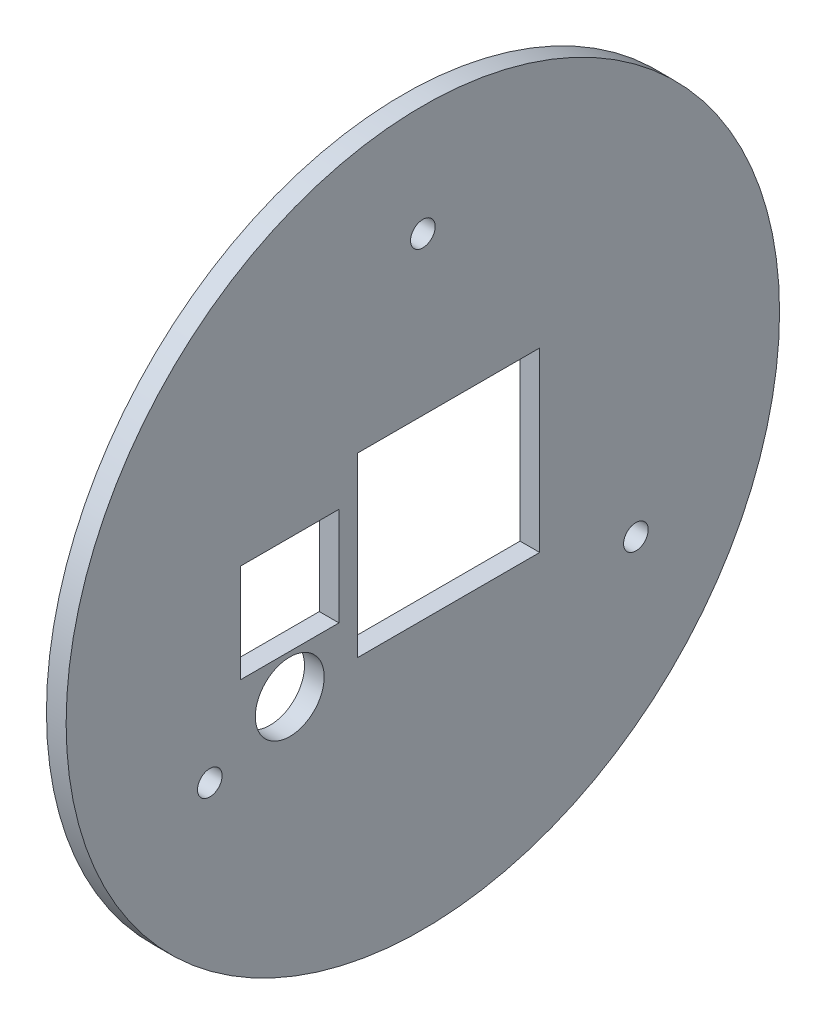
ISO-10303-21;
HEADER;
FILE_DESCRIPTION(('STEP AP214'),'2;1');
FILE_NAME('part.step','',(''),(''),'','','');
FILE_SCHEMA(('AUTOMOTIVE_DESIGN { 1 0 10303 214 1 1 1 1 }'));
ENDSEC;
DATA;
#1=APPLICATION_CONTEXT('core data for automotive mechanical design processes');
#2=APPLICATION_PROTOCOL_DEFINITION('international standard','automotive_design',2000,#1);
#3=PRODUCT_CONTEXT('',#1,'mechanical');
#4=PRODUCT('Part','Part','',(#3));
#5=PRODUCT_RELATED_PRODUCT_CATEGORY('part','',(#4));
#6=PRODUCT_DEFINITION_FORMATION('','',#4);
#7=PRODUCT_DEFINITION_CONTEXT('part definition',#1,'design');
#8=PRODUCT_DEFINITION('design','',#6,#7);
#9=PRODUCT_DEFINITION_SHAPE('','',#8);
#10=(LENGTH_UNIT() NAMED_UNIT(*) SI_UNIT(.MILLI.,.METRE.));
#11=(NAMED_UNIT(*) PLANE_ANGLE_UNIT() SI_UNIT($,.RADIAN.));
#12=(NAMED_UNIT(*) SI_UNIT($,.STERADIAN.) SOLID_ANGLE_UNIT());
#13=UNCERTAINTY_MEASURE_WITH_UNIT(LENGTH_MEASURE(1.E-05),#10,'distance_accuracy_value','');
#14=(GEOMETRIC_REPRESENTATION_CONTEXT(3) GLOBAL_UNCERTAINTY_ASSIGNED_CONTEXT((#13)) GLOBAL_UNIT_ASSIGNED_CONTEXT((#10,
#11,#12)) REPRESENTATION_CONTEXT('',''));
#15=CARTESIAN_POINT('',(0.,0.,0.));
#16=DIRECTION('',(0.,0.,1.));
#17=DIRECTION('',(1.,0.,0.));
#18=AXIS2_PLACEMENT_3D('',#15,#16,#17);
#19=CARTESIAN_POINT('',(4.,0.,0.));
#20=DIRECTION('',(1.,0.,0.));
#21=DIRECTION('',(0.,0.,-1.));
#22=AXIS2_PLACEMENT_3D('',#19,#20,#21);
#23=PLANE('',#22);
#24=CARTESIAN_POINT('',(4.,-25.0000000000019,43.3012701892187));
#25=DIRECTION('',(1.,0.,0.));
#26=DIRECTION('',(0.,0.,-1.));
#27=AXIS2_PLACEMENT_3D('',#24,#25,#26);
#28=CIRCLE('',#27,2.50000000000406);
#29=CARTESIAN_POINT('',(4.,-25.0000000000019,40.8012701892147));
#30=VERTEX_POINT('',#29);
#31=EDGE_CURVE('E140',#30,#30,#28,.T.);
#32=ORIENTED_EDGE('',*,*,#31,.F.);
#33=EDGE_LOOP('',(#32));
#34=FACE_BOUND('',#33,.T.);
#35=CARTESIAN_POINT('',(4.,50.,0.));
#36=DIRECTION('',(1.,0.,0.));
#37=DIRECTION('',(0.,0.,-1.));
#38=AXIS2_PLACEMENT_3D('',#35,#36,#37);
#39=CIRCLE('',#38,2.5);
#40=CARTESIAN_POINT('',(4.,50.,-2.5));
#41=VERTEX_POINT('',#40);
#42=EDGE_CURVE('E152',#41,#41,#39,.T.);
#43=ORIENTED_EDGE('',*,*,#42,.F.);
#44=EDGE_LOOP('',(#43));
#45=FACE_BOUND('',#44,.T.);
#46=CARTESIAN_POINT('',(4.,0.,0.));
#47=DIRECTION('',(1.,0.,0.));
#48=DIRECTION('',(0.,0.,-1.));
#49=AXIS2_PLACEMENT_3D('',#46,#47,#48);
#50=CIRCLE('',#49,72.5);
#51=CARTESIAN_POINT('',(4.,0.,-72.5));
#52=VERTEX_POINT('',#51);
#53=EDGE_CURVE('E11',#52,#52,#50,.T.);
#54=ORIENTED_EDGE('',*,*,#53,.T.);
#55=EDGE_LOOP('',(#54));
#56=FACE_BOUND('',#55,.T.);
#57=DIRECTION('',(0.,0.,-1.));
#58=VECTOR('',#57,1.);
#59=CARTESIAN_POINT('',(4.,-18.,13.2483301477658));
#60=LINE('',#59,#58);
#61=CARTESIAN_POINT('',(4.,-18.,13.2483301477658));
#62=VERTEX_POINT('',#61);
#63=CARTESIAN_POINT('',(4.,-18.,-23.7516698522342));
#64=VERTEX_POINT('',#63);
#65=EDGE_CURVE('E160',#62,#64,#60,.T.);
#66=ORIENTED_EDGE('',*,*,#65,.F.);
#67=DIRECTION('',(0.,-1.,0.));
#68=VECTOR('',#67,1.);
#69=CARTESIAN_POINT('',(4.,18.,13.2483301477658));
#70=LINE('',#69,#68);
#71=CARTESIAN_POINT('',(4.,18.,13.2483301477658));
#72=VERTEX_POINT('',#71);
#73=EDGE_CURVE('E158',#72,#62,#70,.T.);
#74=ORIENTED_EDGE('',*,*,#73,.F.);
#75=DIRECTION('',(0.,0.,1.));
#76=VECTOR('',#75,1.);
#77=CARTESIAN_POINT('',(4.,18.,13.2483301477658));
#78=LINE('',#77,#76);
#79=CARTESIAN_POINT('',(4.,18.,-23.7516698522342));
#80=VERTEX_POINT('',#79);
#81=EDGE_CURVE('E166',#80,#72,#78,.T.);
#82=ORIENTED_EDGE('',*,*,#81,.F.);
#83=DIRECTION('',(0.,1.,0.));
#84=VECTOR('',#83,1.);
#85=CARTESIAN_POINT('',(4.,18.,-23.7516698522342));
#86=LINE('',#85,#84);
#87=EDGE_CURVE('E163',#64,#80,#86,.T.);
#88=ORIENTED_EDGE('',*,*,#87,.F.);
#89=EDGE_LOOP('',(#66,#74,#82,#88));
#90=FACE_BOUND('',#89,.T.);
#91=CARTESIAN_POINT('',(4.,-24.9999999999981,-43.3012701892251));
#92=DIRECTION('',(1.,0.,0.));
#93=DIRECTION('',(0.,0.,-1.));
#94=AXIS2_PLACEMENT_3D('',#91,#92,#93);
#95=CIRCLE('',#94,2.50000000000276);
#96=CARTESIAN_POINT('',(4.,-24.9999999999981,-45.8012701892279));
#97=VERTEX_POINT('',#96);
#98=EDGE_CURVE('E146',#97,#97,#95,.T.);
#99=ORIENTED_EDGE('',*,*,#98,.F.);
#100=EDGE_LOOP('',(#99));
#101=FACE_BOUND('',#100,.T.);
#102=CARTESIAN_POINT('',(4.,-18.,27.0483301477658));
#103=DIRECTION('',(1.,0.,0.));
#104=DIRECTION('',(0.,0.,-1.));
#105=AXIS2_PLACEMENT_3D('',#102,#103,#104);
#106=CIRCLE('',#105,7.);
#107=CARTESIAN_POINT('',(4.,-18.,20.0483301477658));
#108=VERTEX_POINT('',#107);
#109=EDGE_CURVE('E134',#108,#108,#106,.T.);
#110=ORIENTED_EDGE('',*,*,#109,.F.);
#111=EDGE_LOOP('',(#110));
#112=FACE_BOUND('',#111,.T.);
#113=DIRECTION('',(0.,0.,-1.));
#114=VECTOR('',#113,1.);
#115=CARTESIAN_POINT('',(4.,-10.,37.0483301477658));
#116=LINE('',#115,#114);
#117=CARTESIAN_POINT('',(4.,-10.,37.0483301477658));
#118=VERTEX_POINT('',#117);
#119=CARTESIAN_POINT('',(4.,-10.,17.0483301477657));
#120=VERTEX_POINT('',#119);
#121=EDGE_CURVE('E106',#118,#120,#116,.T.);
#122=ORIENTED_EDGE('',*,*,#121,.F.);
#123=DIRECTION('',(0.,-1.,0.));
#124=VECTOR('',#123,1.);
#125=CARTESIAN_POINT('',(4.,10.,37.0483301477658));
#126=LINE('',#125,#124);
#127=CARTESIAN_POINT('',(4.,10.,37.0483301477658));
#128=VERTEX_POINT('',#127);
#129=EDGE_CURVE('E98',#128,#118,#126,.T.);
#130=ORIENTED_EDGE('',*,*,#129,.F.);
#131=DIRECTION('',(0.,0.,1.));
#132=VECTOR('',#131,1.);
#133=CARTESIAN_POINT('',(4.,10.,37.0483301477658));
#134=LINE('',#133,#132);
#135=CARTESIAN_POINT('',(4.,10.,17.0483301477658));
#136=VERTEX_POINT('',#135);
#137=EDGE_CURVE('E120',#136,#128,#134,.T.);
#138=ORIENTED_EDGE('',*,*,#137,.F.);
#139=DIRECTION('',(0.,1.,0.));
#140=VECTOR('',#139,1.);
#141=CARTESIAN_POINT('',(4.,10.,17.0483301477658));
#142=LINE('',#141,#140);
#143=EDGE_CURVE('E118',#120,#136,#142,.T.);
#144=ORIENTED_EDGE('',*,*,#143,.F.);
#145=EDGE_LOOP('',(#122,#130,#138,#144));
#146=FACE_BOUND('',#145,.T.);
#147=ADVANCED_FACE('F33',(#34,#45,#56,#90,#101,#112,#146),#23,.T.);
#148=CARTESIAN_POINT('',(0.,0.,0.));
#149=DIRECTION('',(1.,0.,0.));
#150=DIRECTION('',(0.,0.,-1.));
#151=AXIS2_PLACEMENT_3D('',#148,#149,#150);
#152=PLANE('',#151);
#153=CARTESIAN_POINT('',(0.,-18.,27.0483301477658));
#154=DIRECTION('',(1.,0.,0.));
#155=DIRECTION('',(0.,0.,-1.));
#156=AXIS2_PLACEMENT_3D('',#153,#154,#155);
#157=CIRCLE('',#156,7.);
#158=CARTESIAN_POINT('',(0.,-18.,20.0483301477658));
#159=VERTEX_POINT('',#158);
#160=EDGE_CURVE('E114',#159,#159,#157,.T.);
#161=ORIENTED_EDGE('',*,*,#160,.T.);
#162=EDGE_LOOP('',(#161));
#163=FACE_BOUND('',#162,.T.);
#164=CARTESIAN_POINT('',(0.,-25.0000000000019,43.3012701892187));
#165=DIRECTION('',(1.,0.,0.));
#166=DIRECTION('',(0.,0.,-1.));
#167=AXIS2_PLACEMENT_3D('',#164,#165,#166);
#168=CIRCLE('',#167,2.50000000000406);
#169=CARTESIAN_POINT('',(0.,-25.0000000000019,40.8012701892147));
#170=VERTEX_POINT('',#169);
#171=EDGE_CURVE('E137',#170,#170,#168,.T.);
#172=ORIENTED_EDGE('',*,*,#171,.T.);
#173=EDGE_LOOP('',(#172));
#174=FACE_BOUND('',#173,.T.);
#175=CARTESIAN_POINT('',(0.,-24.9999999999981,-43.3012701892251));
#176=DIRECTION('',(1.,0.,0.));
#177=DIRECTION('',(0.,0.,-1.));
#178=AXIS2_PLACEMENT_3D('',#175,#176,#177);
#179=CIRCLE('',#178,2.50000000000276);
#180=CARTESIAN_POINT('',(0.,-24.9999999999981,-45.8012701892279));
#181=VERTEX_POINT('',#180);
#182=EDGE_CURVE('E143',#181,#181,#179,.T.);
#183=ORIENTED_EDGE('',*,*,#182,.T.);
#184=EDGE_LOOP('',(#183));
#185=FACE_BOUND('',#184,.T.);
#186=CARTESIAN_POINT('',(0.,50.,0.));
#187=DIRECTION('',(1.,0.,0.));
#188=DIRECTION('',(0.,0.,-1.));
#189=AXIS2_PLACEMENT_3D('',#186,#187,#188);
#190=CIRCLE('',#189,2.5);
#191=CARTESIAN_POINT('',(0.,50.,-2.5));
#192=VERTEX_POINT('',#191);
#193=EDGE_CURVE('E149',#192,#192,#190,.T.);
#194=ORIENTED_EDGE('',*,*,#193,.T.);
#195=EDGE_LOOP('',(#194));
#196=FACE_BOUND('',#195,.T.);
#197=DIRECTION('',(0.,-1.,0.));
#198=VECTOR('',#197,1.);
#199=CARTESIAN_POINT('',(0.,18.,13.2483301477658));
#200=LINE('',#199,#198);
#201=CARTESIAN_POINT('',(0.,18.,13.2483301477658));
#202=VERTEX_POINT('',#201);
#203=CARTESIAN_POINT('',(0.,-18.,13.2483301477658));
#204=VERTEX_POINT('',#203);
#205=EDGE_CURVE('E155',#202,#204,#200,.T.);
#206=ORIENTED_EDGE('',*,*,#205,.T.);
#207=DIRECTION('',(0.,0.,-1.));
#208=VECTOR('',#207,1.);
#209=CARTESIAN_POINT('',(0.,-18.,13.2483301477658));
#210=LINE('',#209,#208);
#211=CARTESIAN_POINT('',(0.,-18.,-23.7516698522342));
#212=VERTEX_POINT('',#211);
#213=EDGE_CURVE('E171',#204,#212,#210,.T.);
#214=ORIENTED_EDGE('',*,*,#213,.T.);
#215=DIRECTION('',(0.,1.,0.));
#216=VECTOR('',#215,1.);
#217=CARTESIAN_POINT('',(0.,18.,-23.7516698522342));
#218=LINE('',#217,#216);
#219=CARTESIAN_POINT('',(0.,18.,-23.7516698522342));
#220=VERTEX_POINT('',#219);
#221=EDGE_CURVE('E174',#212,#220,#218,.T.);
#222=ORIENTED_EDGE('',*,*,#221,.T.);
#223=DIRECTION('',(0.,0.,1.));
#224=VECTOR('',#223,1.);
#225=CARTESIAN_POINT('',(0.,18.,13.2483301477658));
#226=LINE('',#225,#224);
#227=EDGE_CURVE('E161',#220,#202,#226,.T.);
#228=ORIENTED_EDGE('',*,*,#227,.T.);
#229=EDGE_LOOP('',(#206,#214,#222,#228));
#230=FACE_BOUND('',#229,.T.);
#231=CARTESIAN_POINT('',(0.,0.,0.));
#232=DIRECTION('',(1.,0.,0.));
#233=DIRECTION('',(0.,0.,-1.));
#234=AXIS2_PLACEMENT_3D('',#231,#232,#233);
#235=CIRCLE('',#234,72.5);
#236=CARTESIAN_POINT('',(0.,0.,-72.5));
#237=VERTEX_POINT('',#236);
#238=EDGE_CURVE('E37',#237,#237,#235,.T.);
#239=ORIENTED_EDGE('',*,*,#238,.F.);
#240=EDGE_LOOP('',(#239));
#241=FACE_BOUND('',#240,.T.);
#242=DIRECTION('',(0.,-1.,0.));
#243=VECTOR('',#242,1.);
#244=CARTESIAN_POINT('',(0.,10.,37.0483301477658));
#245=LINE('',#244,#243);
#246=CARTESIAN_POINT('',(0.,10.,37.0483301477658));
#247=VERTEX_POINT('',#246);
#248=CARTESIAN_POINT('',(0.,-10.,37.0483301477658));
#249=VERTEX_POINT('',#248);
#250=EDGE_CURVE('E56',#247,#249,#245,.T.);
#251=ORIENTED_EDGE('',*,*,#250,.T.);
#252=DIRECTION('',(0.,0.,-1.));
#253=VECTOR('',#252,1.);
#254=CARTESIAN_POINT('',(0.,-10.,37.0483301477658));
#255=LINE('',#254,#253);
#256=CARTESIAN_POINT('',(0.,-10.,17.0483301477657));
#257=VERTEX_POINT('',#256);
#258=EDGE_CURVE('E113',#249,#257,#255,.T.);
#259=ORIENTED_EDGE('',*,*,#258,.T.);
#260=DIRECTION('',(0.,1.,0.));
#261=VECTOR('',#260,1.);
#262=CARTESIAN_POINT('',(0.,10.,17.0483301477658));
#263=LINE('',#262,#261);
#264=CARTESIAN_POINT('',(0.,10.,17.0483301477658));
#265=VERTEX_POINT('',#264);
#266=EDGE_CURVE('E126',#257,#265,#263,.T.);
#267=ORIENTED_EDGE('',*,*,#266,.T.);
#268=DIRECTION('',(0.,0.,1.));
#269=VECTOR('',#268,1.);
#270=CARTESIAN_POINT('',(0.,10.,37.0483301477658));
#271=LINE('',#270,#269);
#272=EDGE_CURVE('E107',#265,#247,#271,.T.);
#273=ORIENTED_EDGE('',*,*,#272,.T.);
#274=EDGE_LOOP('',(#251,#259,#267,#273));
#275=FACE_BOUND('',#274,.T.);
#276=ADVANCED_FACE('F193',(#163,#174,#185,#196,#230,#241,#275),#152,.F.);
#277=CARTESIAN_POINT('',(4.,0.,0.));
#278=DIRECTION('',(-1.,0.,0.));
#279=DIRECTION('',(0.,0.,1.));
#280=AXIS2_PLACEMENT_3D('',#277,#278,#279);
#281=CYLINDRICAL_SURFACE('',#280,72.5);
#282=ORIENTED_EDGE('',*,*,#53,.F.);
#283=EDGE_LOOP('',(#282));
#284=FACE_BOUND('',#283,.T.);
#285=ORIENTED_EDGE('',*,*,#238,.T.);
#286=EDGE_LOOP('',(#285));
#287=FACE_BOUND('',#286,.T.);
#288=ADVANCED_FACE('F35',(#284,#287),#281,.T.);
#289=CARTESIAN_POINT('',(4.,18.,13.2483301477658));
#290=DIRECTION('',(0.,0.,-1.));
#291=DIRECTION('',(-1.,0.,0.));
#292=AXIS2_PLACEMENT_3D('',#289,#290,#291);
#293=PLANE('',#292);
#294=ORIENTED_EDGE('',*,*,#205,.F.);
#295=DIRECTION('',(-1.,0.,0.));
#296=VECTOR('',#295,1.);
#297=CARTESIAN_POINT('',(4.,18.,13.2483301477658));
#298=LINE('',#297,#296);
#299=EDGE_CURVE('E168',#72,#202,#298,.T.);
#300=ORIENTED_EDGE('',*,*,#299,.F.);
#301=ORIENTED_EDGE('',*,*,#73,.T.);
#302=DIRECTION('',(-1.,0.,0.));
#303=VECTOR('',#302,1.);
#304=CARTESIAN_POINT('',(4.,-18.,13.2483301477658));
#305=LINE('',#304,#303);
#306=EDGE_CURVE('E185',#62,#204,#305,.T.);
#307=ORIENTED_EDGE('',*,*,#306,.T.);
#308=EDGE_LOOP('',(#294,#300,#301,#307));
#309=FACE_BOUND('',#308,.T.);
#310=ADVANCED_FACE('F215',(#309),#293,.T.);
#311=CARTESIAN_POINT('',(4.,-18.,13.2483301477658));
#312=DIRECTION('',(0.,1.,0.));
#313=DIRECTION('',(0.,0.,1.));
#314=AXIS2_PLACEMENT_3D('',#311,#312,#313);
#315=PLANE('',#314);
#316=ORIENTED_EDGE('',*,*,#213,.F.);
#317=ORIENTED_EDGE('',*,*,#306,.F.);
#318=ORIENTED_EDGE('',*,*,#65,.T.);
#319=DIRECTION('',(-1.,0.,0.));
#320=VECTOR('',#319,1.);
#321=CARTESIAN_POINT('',(4.,-18.,-23.7516698522342));
#322=LINE('',#321,#320);
#323=EDGE_CURVE('E183',#64,#212,#322,.T.);
#324=ORIENTED_EDGE('',*,*,#323,.T.);
#325=EDGE_LOOP('',(#316,#317,#318,#324));
#326=FACE_BOUND('',#325,.T.);
#327=ADVANCED_FACE('F218',(#326),#315,.T.);
#328=CARTESIAN_POINT('',(4.,18.,-23.7516698522342));
#329=DIRECTION('',(0.,0.,1.));
#330=DIRECTION('',(1.,0.,0.));
#331=AXIS2_PLACEMENT_3D('',#328,#329,#330);
#332=PLANE('',#331);
#333=ORIENTED_EDGE('',*,*,#221,.F.);
#334=ORIENTED_EDGE('',*,*,#323,.F.);
#335=ORIENTED_EDGE('',*,*,#87,.T.);
#336=DIRECTION('',(-1.,0.,0.));
#337=VECTOR('',#336,1.);
#338=CARTESIAN_POINT('',(4.,18.,-23.7516698522342));
#339=LINE('',#338,#337);
#340=EDGE_CURVE('E181',#80,#220,#339,.T.);
#341=ORIENTED_EDGE('',*,*,#340,.T.);
#342=EDGE_LOOP('',(#333,#334,#335,#341));
#343=FACE_BOUND('',#342,.T.);
#344=ADVANCED_FACE('F221',(#343),#332,.T.);
#345=CARTESIAN_POINT('',(4.,18.,13.2483301477658));
#346=DIRECTION('',(0.,-1.,0.));
#347=DIRECTION('',(0.,0.,-1.));
#348=AXIS2_PLACEMENT_3D('',#345,#346,#347);
#349=PLANE('',#348);
#350=ORIENTED_EDGE('',*,*,#227,.F.);
#351=ORIENTED_EDGE('',*,*,#340,.F.);
#352=ORIENTED_EDGE('',*,*,#81,.T.);
#353=ORIENTED_EDGE('',*,*,#299,.T.);
#354=EDGE_LOOP('',(#350,#351,#352,#353));
#355=FACE_BOUND('',#354,.T.);
#356=ADVANCED_FACE('F225',(#355),#349,.T.);
#357=CARTESIAN_POINT('',(4.,50.,0.));
#358=DIRECTION('',(-1.,0.,0.));
#359=DIRECTION('',(0.,0.,1.));
#360=AXIS2_PLACEMENT_3D('',#357,#358,#359);
#361=CYLINDRICAL_SURFACE('',#360,2.5);
#362=ORIENTED_EDGE('',*,*,#42,.T.);
#363=EDGE_LOOP('',(#362));
#364=FACE_BOUND('',#363,.T.);
#365=ORIENTED_EDGE('',*,*,#193,.F.);
#366=EDGE_LOOP('',(#365));
#367=FACE_BOUND('',#366,.T.);
#368=ADVANCED_FACE('F229',(#364,#367),#361,.F.);
#369=CARTESIAN_POINT('',(4.,-24.9999999999981,-43.3012701892251));
#370=DIRECTION('',(-1.,0.,0.));
#371=DIRECTION('',(0.,0.,1.));
#372=AXIS2_PLACEMENT_3D('',#369,#370,#371);
#373=CYLINDRICAL_SURFACE('',#372,2.50000000000276);
#374=ORIENTED_EDGE('',*,*,#98,.T.);
#375=EDGE_LOOP('',(#374));
#376=FACE_BOUND('',#375,.T.);
#377=ORIENTED_EDGE('',*,*,#182,.F.);
#378=EDGE_LOOP('',(#377));
#379=FACE_BOUND('',#378,.T.);
#380=ADVANCED_FACE('F233',(#376,#379),#373,.F.);
#381=CARTESIAN_POINT('',(4.,-25.0000000000019,43.3012701892187));
#382=DIRECTION('',(-1.,0.,0.));
#383=DIRECTION('',(0.,0.,1.));
#384=AXIS2_PLACEMENT_3D('',#381,#382,#383);
#385=CYLINDRICAL_SURFACE('',#384,2.50000000000406);
#386=ORIENTED_EDGE('',*,*,#31,.T.);
#387=EDGE_LOOP('',(#386));
#388=FACE_BOUND('',#387,.T.);
#389=ORIENTED_EDGE('',*,*,#171,.F.);
#390=EDGE_LOOP('',(#389));
#391=FACE_BOUND('',#390,.T.);
#392=ADVANCED_FACE('F237',(#388,#391),#385,.F.);
#393=CARTESIAN_POINT('',(4.,-18.,27.0483301477658));
#394=DIRECTION('',(-1.,0.,0.));
#395=DIRECTION('',(0.,0.,1.));
#396=AXIS2_PLACEMENT_3D('',#393,#394,#395);
#397=CYLINDRICAL_SURFACE('',#396,7.);
#398=ORIENTED_EDGE('',*,*,#109,.T.);
#399=EDGE_LOOP('',(#398));
#400=FACE_BOUND('',#399,.T.);
#401=ORIENTED_EDGE('',*,*,#160,.F.);
#402=EDGE_LOOP('',(#401));
#403=FACE_BOUND('',#402,.T.);
#404=ADVANCED_FACE('F241',(#400,#403),#397,.F.);
#405=CARTESIAN_POINT('',(4.,10.,37.0483301477658));
#406=DIRECTION('',(0.,0.,-1.));
#407=DIRECTION('',(-1.,0.,0.));
#408=AXIS2_PLACEMENT_3D('',#405,#406,#407);
#409=PLANE('',#408);
#410=ORIENTED_EDGE('',*,*,#250,.F.);
#411=DIRECTION('',(-1.,0.,0.));
#412=VECTOR('',#411,1.);
#413=CARTESIAN_POINT('',(4.,10.,37.0483301477658));
#414=LINE('',#413,#412);
#415=EDGE_CURVE('E102',#128,#247,#414,.T.);
#416=ORIENTED_EDGE('',*,*,#415,.F.);
#417=ORIENTED_EDGE('',*,*,#129,.T.);
#418=DIRECTION('',(-1.,0.,0.));
#419=VECTOR('',#418,1.);
#420=CARTESIAN_POINT('',(4.,-10.,37.0483301477658));
#421=LINE('',#420,#419);
#422=EDGE_CURVE('E101',#118,#249,#421,.T.);
#423=ORIENTED_EDGE('',*,*,#422,.T.);
#424=EDGE_LOOP('',(#410,#416,#417,#423));
#425=FACE_BOUND('',#424,.T.);
#426=ADVANCED_FACE('F100',(#425),#409,.T.);
#427=CARTESIAN_POINT('',(4.,-10.,37.0483301477658));
#428=DIRECTION('',(0.,1.,0.));
#429=DIRECTION('',(0.,0.,1.));
#430=AXIS2_PLACEMENT_3D('',#427,#428,#429);
#431=PLANE('',#430);
#432=ORIENTED_EDGE('',*,*,#258,.F.);
#433=ORIENTED_EDGE('',*,*,#422,.F.);
#434=ORIENTED_EDGE('',*,*,#121,.T.);
#435=DIRECTION('',(-1.,0.,0.));
#436=VECTOR('',#435,1.);
#437=CARTESIAN_POINT('',(4.,-10.,17.0483301477657));
#438=LINE('',#437,#436);
#439=EDGE_CURVE('E115',#120,#257,#438,.T.);
#440=ORIENTED_EDGE('',*,*,#439,.T.);
#441=EDGE_LOOP('',(#432,#433,#434,#440));
#442=FACE_BOUND('',#441,.T.);
#443=ADVANCED_FACE('F110',(#442),#431,.T.);
#444=CARTESIAN_POINT('',(4.,10.,17.0483301477658));
#445=DIRECTION('',(0.,0.,1.));
#446=DIRECTION('',(0.,-1.,0.));
#447=AXIS2_PLACEMENT_3D('',#444,#445,#446);
#448=PLANE('',#447);
#449=ORIENTED_EDGE('',*,*,#266,.F.);
#450=ORIENTED_EDGE('',*,*,#439,.F.);
#451=ORIENTED_EDGE('',*,*,#143,.T.);
#452=DIRECTION('',(-1.,0.,0.));
#453=VECTOR('',#452,1.);
#454=CARTESIAN_POINT('',(4.,10.,17.0483301477658));
#455=LINE('',#454,#453);
#456=EDGE_CURVE('E48',#136,#265,#455,.T.);
#457=ORIENTED_EDGE('',*,*,#456,.T.);
#458=EDGE_LOOP('',(#449,#450,#451,#457));
#459=FACE_BOUND('',#458,.T.);
#460=ADVANCED_FACE('F200',(#459),#448,.T.);
#461=CARTESIAN_POINT('',(4.,10.,37.0483301477658));
#462=DIRECTION('',(0.,-1.,0.));
#463=DIRECTION('',(0.,0.,-1.));
#464=AXIS2_PLACEMENT_3D('',#461,#462,#463);
#465=PLANE('',#464);
#466=ORIENTED_EDGE('',*,*,#272,.F.);
#467=ORIENTED_EDGE('',*,*,#456,.F.);
#468=ORIENTED_EDGE('',*,*,#137,.T.);
#469=ORIENTED_EDGE('',*,*,#415,.T.);
#470=EDGE_LOOP('',(#466,#467,#468,#469));
#471=FACE_BOUND('',#470,.T.);
#472=ADVANCED_FACE('F198',(#471),#465,.T.);
#473=CLOSED_SHELL('',(#147,#276,#288,#310,#327,#344,#356,#368,#380,#392,#404,#426,#443,#460,#472));
#474=MANIFOLD_SOLID_BREP('B2',#473);
#475=ADVANCED_BREP_SHAPE_REPRESENTATION('',(#18,#474),#14);
#476=SHAPE_DEFINITION_REPRESENTATION(#9,#475);
ENDSEC;
END-ISO-10303-21;
